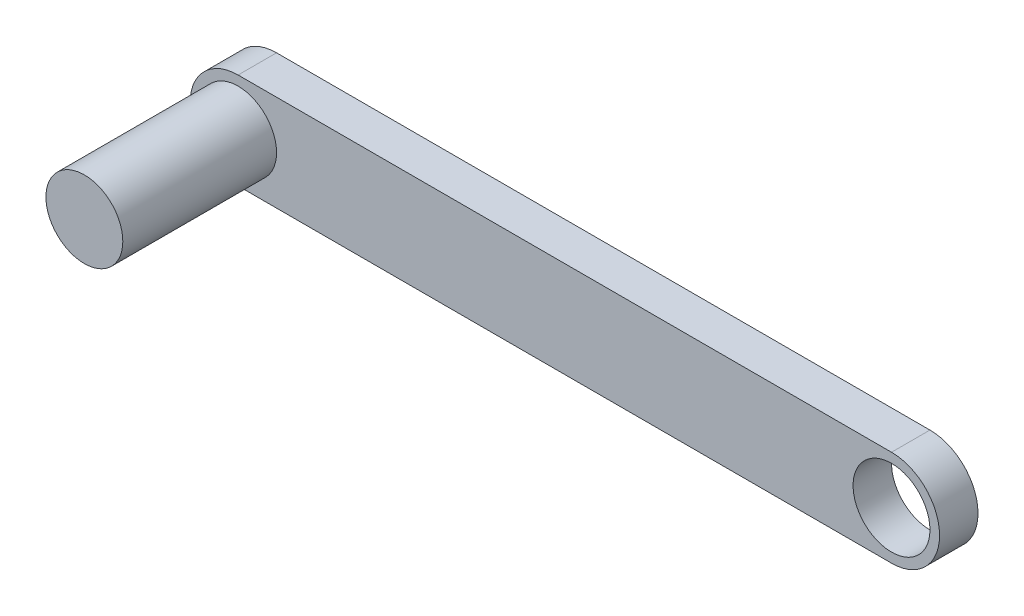
ISO-10303-21;
HEADER;
FILE_DESCRIPTION(('STEP AP214'),'2;1');
FILE_NAME('part.step','',(''),(''),'','','');
FILE_SCHEMA(('AUTOMOTIVE_DESIGN { 1 0 10303 214 1 1 1 1 }'));
ENDSEC;
DATA;
#1=APPLICATION_CONTEXT('core data for automotive mechanical design processes');
#2=APPLICATION_PROTOCOL_DEFINITION('international standard','automotive_design',2000,#1);
#3=PRODUCT_CONTEXT('',#1,'mechanical');
#4=PRODUCT('Part','Part','',(#3));
#5=PRODUCT_RELATED_PRODUCT_CATEGORY('part','',(#4));
#6=PRODUCT_DEFINITION_FORMATION('','',#4);
#7=PRODUCT_DEFINITION_CONTEXT('part definition',#1,'design');
#8=PRODUCT_DEFINITION('design','',#6,#7);
#9=PRODUCT_DEFINITION_SHAPE('','',#8);
#10=(LENGTH_UNIT() NAMED_UNIT(*) SI_UNIT(.MILLI.,.METRE.));
#11=(NAMED_UNIT(*) PLANE_ANGLE_UNIT() SI_UNIT($,.RADIAN.));
#12=(NAMED_UNIT(*) SI_UNIT($,.STERADIAN.) SOLID_ANGLE_UNIT());
#13=UNCERTAINTY_MEASURE_WITH_UNIT(LENGTH_MEASURE(1.E-05),#10,'distance_accuracy_value','');
#14=(GEOMETRIC_REPRESENTATION_CONTEXT(3) GLOBAL_UNCERTAINTY_ASSIGNED_CONTEXT((#13)) GLOBAL_UNIT_ASSIGNED_CONTEXT((#10,
#11,#12)) REPRESENTATION_CONTEXT('',''));
#15=CARTESIAN_POINT('',(0.,0.,0.));
#16=DIRECTION('',(0.,0.,1.));
#17=DIRECTION('',(1.,0.,0.));
#18=AXIS2_PLACEMENT_3D('',#15,#16,#17);
#19=CARTESIAN_POINT('',(0.,0.,2.));
#20=DIRECTION('',(0.,0.,-1.));
#21=DIRECTION('',(-1.,0.,0.));
#22=AXIS2_PLACEMENT_3D('',#19,#20,#21);
#23=CYLINDRICAL_SURFACE('',#22,2.5);
#24=CARTESIAN_POINT('',(0.,0.,0.));
#25=DIRECTION('',(0.,0.,1.));
#26=DIRECTION('',(1.,0.,0.));
#27=AXIS2_PLACEMENT_3D('',#24,#25,#26);
#28=CIRCLE('',#27,2.5);
#29=CARTESIAN_POINT('',(0.,2.5,0.));
#30=VERTEX_POINT('',#29);
#31=CARTESIAN_POINT('',(0.,-2.5,0.));
#32=VERTEX_POINT('',#31);
#33=EDGE_CURVE('E115',#30,#32,#28,.T.);
#34=ORIENTED_EDGE('',*,*,#33,.T.);
#35=DIRECTION('',(0.,0.,-1.));
#36=VECTOR('',#35,1.);
#37=CARTESIAN_POINT('',(0.,-2.5,2.));
#38=LINE('',#37,#36);
#39=CARTESIAN_POINT('',(0.,-2.5,2.));
#40=VERTEX_POINT('',#39);
#41=EDGE_CURVE('E11',#40,#32,#38,.T.);
#42=ORIENTED_EDGE('',*,*,#41,.F.);
#43=CARTESIAN_POINT('',(0.,0.,2.));
#44=DIRECTION('',(0.,0.,1.));
#45=DIRECTION('',(1.,0.,0.));
#46=AXIS2_PLACEMENT_3D('',#43,#44,#45);
#47=CIRCLE('',#46,2.5);
#48=CARTESIAN_POINT('',(0.,2.5,2.));
#49=VERTEX_POINT('',#48);
#50=EDGE_CURVE('E98',#49,#40,#47,.T.);
#51=ORIENTED_EDGE('',*,*,#50,.F.);
#52=DIRECTION('',(0.,0.,-1.));
#53=VECTOR('',#52,1.);
#54=CARTESIAN_POINT('',(0.,2.5,2.));
#55=LINE('',#54,#53);
#56=EDGE_CURVE('E111',#49,#30,#55,.T.);
#57=ORIENTED_EDGE('',*,*,#56,.T.);
#58=EDGE_LOOP('',(#34,#42,#51,#57));
#59=FACE_BOUND('',#58,.T.);
#60=ADVANCED_FACE('F45',(#59),#23,.T.);
#61=CARTESIAN_POINT('',(0.,-2.5,2.));
#62=DIRECTION('',(0.,1.,0.));
#63=DIRECTION('',(-1.,0.,0.));
#64=AXIS2_PLACEMENT_3D('',#61,#62,#63);
#65=PLANE('',#64);
#66=DIRECTION('',(1.,0.,0.));
#67=VECTOR('',#66,1.);
#68=CARTESIAN_POINT('',(0.,-2.5,0.));
#69=LINE('',#68,#67);
#70=CARTESIAN_POINT('',(34.,-2.5,0.));
#71=VERTEX_POINT('',#70);
#72=EDGE_CURVE('E103',#32,#71,#69,.T.);
#73=ORIENTED_EDGE('',*,*,#72,.T.);
#74=DIRECTION('',(0.,0.,-1.));
#75=VECTOR('',#74,1.);
#76=CARTESIAN_POINT('',(34.,-2.5,2.));
#77=LINE('',#76,#75);
#78=CARTESIAN_POINT('',(34.,-2.5,2.));
#79=VERTEX_POINT('',#78);
#80=EDGE_CURVE('E55',#79,#71,#77,.T.);
#81=ORIENTED_EDGE('',*,*,#80,.F.);
#82=DIRECTION('',(1.,0.,0.));
#83=VECTOR('',#82,1.);
#84=CARTESIAN_POINT('',(0.,-2.5,2.));
#85=LINE('',#84,#83);
#86=EDGE_CURVE('E93',#40,#79,#85,.T.);
#87=ORIENTED_EDGE('',*,*,#86,.F.);
#88=ORIENTED_EDGE('',*,*,#41,.T.);
#89=EDGE_LOOP('',(#73,#81,#87,#88));
#90=FACE_BOUND('',#89,.T.);
#91=ADVANCED_FACE('F102',(#90),#65,.F.);
#92=CARTESIAN_POINT('',(34.,0.,2.));
#93=DIRECTION('',(0.,0.,-1.));
#94=DIRECTION('',(-1.,0.,0.));
#95=AXIS2_PLACEMENT_3D('',#92,#93,#94);
#96=CYLINDRICAL_SURFACE('',#95,2.5);
#97=CARTESIAN_POINT('',(34.,0.,0.));
#98=DIRECTION('',(0.,0.,1.));
#99=DIRECTION('',(1.,0.,0.));
#100=AXIS2_PLACEMENT_3D('',#97,#98,#99);
#101=CIRCLE('',#100,2.5);
#102=CARTESIAN_POINT('',(34.,2.5,0.));
#103=VERTEX_POINT('',#102);
#104=EDGE_CURVE('E80',#71,#103,#101,.T.);
#105=ORIENTED_EDGE('',*,*,#104,.T.);
#106=DIRECTION('',(0.,0.,-1.));
#107=VECTOR('',#106,1.);
#108=CARTESIAN_POINT('',(34.,2.5,2.));
#109=LINE('',#108,#107);
#110=CARTESIAN_POINT('',(34.,2.5,2.));
#111=VERTEX_POINT('',#110);
#112=EDGE_CURVE('E105',#111,#103,#109,.T.);
#113=ORIENTED_EDGE('',*,*,#112,.F.);
#114=CARTESIAN_POINT('',(34.,0.,2.));
#115=DIRECTION('',(0.,0.,1.));
#116=DIRECTION('',(1.,0.,0.));
#117=AXIS2_PLACEMENT_3D('',#114,#115,#116);
#118=CIRCLE('',#117,2.5);
#119=EDGE_CURVE('E96',#79,#111,#118,.T.);
#120=ORIENTED_EDGE('',*,*,#119,.F.);
#121=ORIENTED_EDGE('',*,*,#80,.T.);
#122=EDGE_LOOP('',(#105,#113,#120,#121));
#123=FACE_BOUND('',#122,.T.);
#124=ADVANCED_FACE('F107',(#123),#96,.T.);
#125=CARTESIAN_POINT('',(0.,2.5,2.));
#126=DIRECTION('',(0.,-1.,0.));
#127=DIRECTION('',(1.,0.,0.));
#128=AXIS2_PLACEMENT_3D('',#125,#126,#127);
#129=PLANE('',#128);
#130=DIRECTION('',(-1.,0.,0.));
#131=VECTOR('',#130,1.);
#132=CARTESIAN_POINT('',(0.,2.5,0.));
#133=LINE('',#132,#131);
#134=EDGE_CURVE('E86',#103,#30,#133,.T.);
#135=ORIENTED_EDGE('',*,*,#134,.T.);
#136=ORIENTED_EDGE('',*,*,#56,.F.);
#137=DIRECTION('',(-1.,0.,0.));
#138=VECTOR('',#137,1.);
#139=CARTESIAN_POINT('',(0.,2.5,2.));
#140=LINE('',#139,#138);
#141=EDGE_CURVE('E63',#111,#49,#140,.T.);
#142=ORIENTED_EDGE('',*,*,#141,.F.);
#143=ORIENTED_EDGE('',*,*,#112,.T.);
#144=EDGE_LOOP('',(#135,#136,#142,#143));
#145=FACE_BOUND('',#144,.T.);
#146=ADVANCED_FACE('F129',(#145),#129,.F.);
#147=CARTESIAN_POINT('',(0.,0.,2.));
#148=DIRECTION('',(0.,0.,1.));
#149=DIRECTION('',(1.,0.,0.));
#150=AXIS2_PLACEMENT_3D('',#147,#148,#149);
#151=PLANE('',#150);
#152=CARTESIAN_POINT('',(34.,0.,2.));
#153=DIRECTION('',(0.,0.,1.));
#154=DIRECTION('',(1.,0.,0.));
#155=AXIS2_PLACEMENT_3D('',#152,#153,#154);
#156=CIRCLE('',#155,2.);
#157=CARTESIAN_POINT('',(36.,0.,2.));
#158=VERTEX_POINT('',#157);
#159=EDGE_CURVE('E140',#158,#158,#156,.T.);
#160=ORIENTED_EDGE('',*,*,#159,.F.);
#161=EDGE_LOOP('',(#160));
#162=FACE_BOUND('',#161,.T.);
#163=CARTESIAN_POINT('',(0.,0.,2.));
#164=DIRECTION('',(0.,0.,1.));
#165=DIRECTION('',(1.,0.,0.));
#166=AXIS2_PLACEMENT_3D('',#163,#164,#165);
#167=CIRCLE('',#166,2.);
#168=CARTESIAN_POINT('',(2.,0.,2.));
#169=VERTEX_POINT('',#168);
#170=EDGE_CURVE('E136',#169,#169,#167,.T.);
#171=ORIENTED_EDGE('',*,*,#170,.F.);
#172=EDGE_LOOP('',(#171));
#173=FACE_BOUND('',#172,.T.);
#174=ORIENTED_EDGE('',*,*,#50,.T.);
#175=ORIENTED_EDGE('',*,*,#86,.T.);
#176=ORIENTED_EDGE('',*,*,#119,.T.);
#177=ORIENTED_EDGE('',*,*,#141,.T.);
#178=EDGE_LOOP('',(#174,#175,#176,#177));
#179=FACE_BOUND('',#178,.T.);
#180=ADVANCED_FACE('F94',(#162,#173,#179),#151,.T.);
#181=CARTESIAN_POINT('',(0.,0.,0.));
#182=DIRECTION('',(0.,0.,1.));
#183=DIRECTION('',(1.,0.,0.));
#184=AXIS2_PLACEMENT_3D('',#181,#182,#183);
#185=PLANE('',#184);
#186=CARTESIAN_POINT('',(34.,0.,0.));
#187=DIRECTION('',(0.,0.,1.));
#188=DIRECTION('',(1.,0.,0.));
#189=AXIS2_PLACEMENT_3D('',#186,#187,#188);
#190=CIRCLE('',#189,2.);
#191=CARTESIAN_POINT('',(36.,0.,0.));
#192=VERTEX_POINT('',#191);
#193=EDGE_CURVE('E48',#192,#192,#190,.T.);
#194=ORIENTED_EDGE('',*,*,#193,.T.);
#195=EDGE_LOOP('',(#194));
#196=FACE_BOUND('',#195,.T.);
#197=ORIENTED_EDGE('',*,*,#33,.F.);
#198=ORIENTED_EDGE('',*,*,#134,.F.);
#199=ORIENTED_EDGE('',*,*,#104,.F.);
#200=ORIENTED_EDGE('',*,*,#72,.F.);
#201=EDGE_LOOP('',(#197,#198,#199,#200));
#202=FACE_BOUND('',#201,.T.);
#203=ADVANCED_FACE('F132',(#196,#202),#185,.F.);
#204=CARTESIAN_POINT('',(0.,0.,10.));
#205=DIRECTION('',(0.,0.,-1.));
#206=DIRECTION('',(-1.,0.,0.));
#207=AXIS2_PLACEMENT_3D('',#204,#205,#206);
#208=CYLINDRICAL_SURFACE('',#207,2.);
#209=CARTESIAN_POINT('',(0.,0.,10.));
#210=DIRECTION('',(0.,0.,1.));
#211=DIRECTION('',(1.,0.,0.));
#212=AXIS2_PLACEMENT_3D('',#209,#210,#211);
#213=CIRCLE('',#212,2.);
#214=CARTESIAN_POINT('',(2.,0.,10.));
#215=VERTEX_POINT('',#214);
#216=EDGE_CURVE('E119',#215,#215,#213,.T.);
#217=ORIENTED_EDGE('',*,*,#216,.F.);
#218=EDGE_LOOP('',(#217));
#219=FACE_BOUND('',#218,.T.);
#220=ORIENTED_EDGE('',*,*,#170,.T.);
#221=EDGE_LOOP('',(#220));
#222=FACE_BOUND('',#221,.T.);
#223=ADVANCED_FACE('F161',(#219,#222),#208,.T.);
#224=CARTESIAN_POINT('',(0.,0.,10.));
#225=DIRECTION('',(0.,0.,1.));
#226=DIRECTION('',(1.,0.,0.));
#227=AXIS2_PLACEMENT_3D('',#224,#225,#226);
#228=PLANE('',#227);
#229=ORIENTED_EDGE('',*,*,#216,.T.);
#230=EDGE_LOOP('',(#229));
#231=FACE_BOUND('',#230,.T.);
#232=ADVANCED_FACE('F155',(#231),#228,.T.);
#233=CARTESIAN_POINT('',(34.,0.,4.));
#234=DIRECTION('',(0.,0.,-1.));
#235=DIRECTION('',(-1.,0.,0.));
#236=AXIS2_PLACEMENT_3D('',#233,#234,#235);
#237=CYLINDRICAL_SURFACE('',#236,2.);
#238=ORIENTED_EDGE('',*,*,#159,.T.);
#239=EDGE_LOOP('',(#238));
#240=FACE_BOUND('',#239,.T.);
#241=ORIENTED_EDGE('',*,*,#193,.F.);
#242=EDGE_LOOP('',(#241));
#243=FACE_BOUND('',#242,.T.);
#244=ADVANCED_FACE('F153',(#240,#243),#237,.F.);
#245=CLOSED_SHELL('',(#60,#91,#124,#146,#180,#203,#223,#232,#244));
#246=MANIFOLD_SOLID_BREP('B2',#245);
#247=ADVANCED_BREP_SHAPE_REPRESENTATION('',(#18,#246),#14);
#248=SHAPE_DEFINITION_REPRESENTATION(#9,#247);
ENDSEC;
END-ISO-10303-21;
